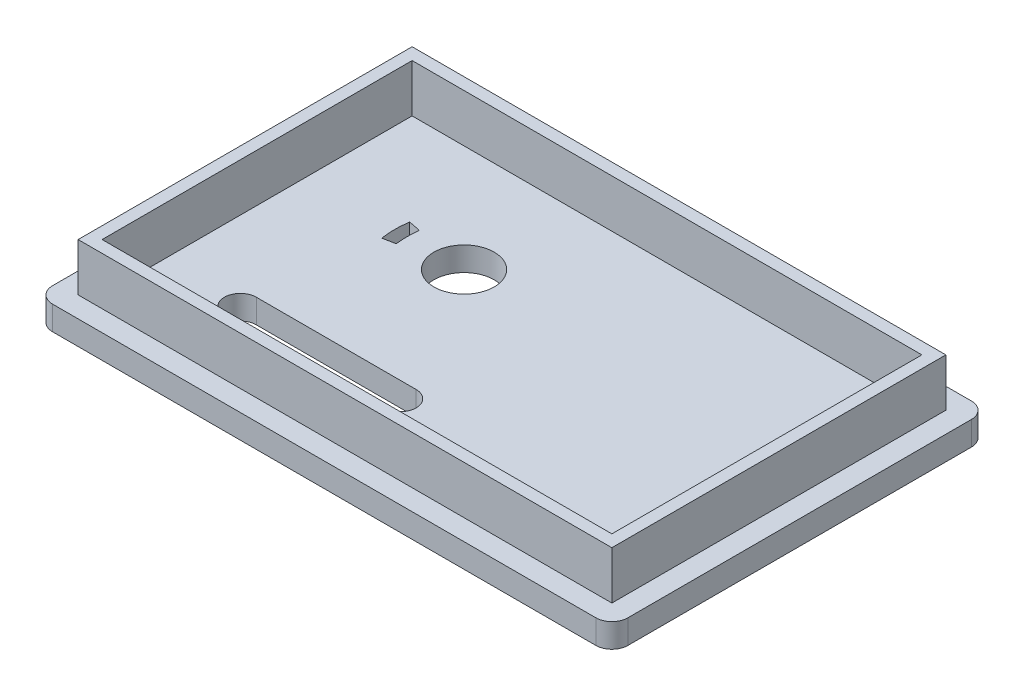
ISO-10303-21;
HEADER;
FILE_DESCRIPTION(('STEP AP214'),'2;1');
FILE_NAME('part.step','',(''),(''),'','','');
FILE_SCHEMA(('AUTOMOTIVE_DESIGN { 1 0 10303 214 1 1 1 1 }'));
ENDSEC;
DATA;
#1=APPLICATION_CONTEXT('core data for automotive mechanical design processes');
#2=APPLICATION_PROTOCOL_DEFINITION('international standard','automotive_design',2000,#1);
#3=PRODUCT_CONTEXT('',#1,'mechanical');
#4=PRODUCT('Part','Part','',(#3));
#5=PRODUCT_RELATED_PRODUCT_CATEGORY('part','',(#4));
#6=PRODUCT_DEFINITION_FORMATION('','',#4);
#7=PRODUCT_DEFINITION_CONTEXT('part definition',#1,'design');
#8=PRODUCT_DEFINITION('design','',#6,#7);
#9=PRODUCT_DEFINITION_SHAPE('','',#8);
#10=(LENGTH_UNIT() NAMED_UNIT(*) SI_UNIT(.MILLI.,.METRE.));
#11=(NAMED_UNIT(*) PLANE_ANGLE_UNIT() SI_UNIT($,.RADIAN.));
#12=(NAMED_UNIT(*) SI_UNIT($,.STERADIAN.) SOLID_ANGLE_UNIT());
#13=UNCERTAINTY_MEASURE_WITH_UNIT(LENGTH_MEASURE(1.E-05),#10,'distance_accuracy_value','');
#14=(GEOMETRIC_REPRESENTATION_CONTEXT(3) GLOBAL_UNCERTAINTY_ASSIGNED_CONTEXT((#13)) GLOBAL_UNIT_ASSIGNED_CONTEXT((#10,
#11,#12)) REPRESENTATION_CONTEXT('',''));
#15=CARTESIAN_POINT('',(0.,0.,0.));
#16=DIRECTION('',(0.,0.,1.));
#17=DIRECTION('',(1.,0.,0.));
#18=AXIS2_PLACEMENT_3D('',#15,#16,#17);
#19=CARTESIAN_POINT('',(0.,3.,0.));
#20=DIRECTION('',(0.,-1.,0.));
#21=DIRECTION('',(0.,0.,-1.));
#22=AXIS2_PLACEMENT_3D('',#19,#20,#21);
#23=PLANE('',#22);
#24=DIRECTION('',(0.,0.,-1.));
#25=VECTOR('',#24,1.);
#26=CARTESIAN_POINT('',(0.,3.,0.));
#27=LINE('',#26,#25);
#28=CARTESIAN_POINT('',(0.,3.,-2.));
#29=VERTEX_POINT('',#28);
#30=CARTESIAN_POINT('',(0.,3.,-45.));
#31=VERTEX_POINT('',#30);
#32=EDGE_CURVE('E370',#29,#31,#27,.T.);
#33=ORIENTED_EDGE('',*,*,#32,.F.);
#34=CARTESIAN_POINT('',(2.,3.,-2.));
#35=DIRECTION('',(0.,-1.,0.));
#36=DIRECTION('',(0.,0.,-1.));
#37=AXIS2_PLACEMENT_3D('',#34,#35,#36);
#38=CIRCLE('',#37,2.);
#39=CARTESIAN_POINT('',(2.,3.,0.));
#40=VERTEX_POINT('',#39);
#41=EDGE_CURVE('E436',#29,#40,#38,.F.);
#42=ORIENTED_EDGE('',*,*,#41,.T.);
#43=DIRECTION('',(1.,0.,0.));
#44=VECTOR('',#43,1.);
#45=CARTESIAN_POINT('',(0.,3.,0.));
#46=LINE('',#45,#44);
#47=CARTESIAN_POINT('',(70.,3.,0.));
#48=VERTEX_POINT('',#47);
#49=EDGE_CURVE('E383',#40,#48,#46,.T.);
#50=ORIENTED_EDGE('',*,*,#49,.T.);
#51=CARTESIAN_POINT('',(70.,3.,-2.));
#52=DIRECTION('',(0.,-1.,0.));
#53=DIRECTION('',(0.,0.,-1.));
#54=AXIS2_PLACEMENT_3D('',#51,#52,#53);
#55=CIRCLE('',#54,2.);
#56=CARTESIAN_POINT('',(72.,3.,-2.));
#57=VERTEX_POINT('',#56);
#58=EDGE_CURVE('E427',#48,#57,#55,.F.);
#59=ORIENTED_EDGE('',*,*,#58,.T.);
#60=DIRECTION('',(0.,0.,-1.));
#61=VECTOR('',#60,1.);
#62=CARTESIAN_POINT('',(72.,3.,0.));
#63=LINE('',#62,#61);
#64=CARTESIAN_POINT('',(72.,3.,-45.));
#65=VERTEX_POINT('',#64);
#66=EDGE_CURVE('E379',#57,#65,#63,.T.);
#67=ORIENTED_EDGE('',*,*,#66,.T.);
#68=CARTESIAN_POINT('',(70.,3.,-45.));
#69=DIRECTION('',(0.,-1.,0.));
#70=DIRECTION('',(0.,0.,-1.));
#71=AXIS2_PLACEMENT_3D('',#68,#69,#70);
#72=CIRCLE('',#71,2.);
#73=CARTESIAN_POINT('',(70.,3.,-47.));
#74=VERTEX_POINT('',#73);
#75=EDGE_CURVE('E430',#65,#74,#72,.F.);
#76=ORIENTED_EDGE('',*,*,#75,.T.);
#77=DIRECTION('',(1.,0.,0.));
#78=VECTOR('',#77,1.);
#79=CARTESIAN_POINT('',(0.,3.,-47.));
#80=LINE('',#79,#78);
#81=CARTESIAN_POINT('',(2.,3.,-47.));
#82=VERTEX_POINT('',#81);
#83=EDGE_CURVE('E374',#82,#74,#80,.T.);
#84=ORIENTED_EDGE('',*,*,#83,.F.);
#85=CARTESIAN_POINT('',(2.,3.,-45.));
#86=DIRECTION('',(0.,-1.,0.));
#87=DIRECTION('',(0.,0.,-1.));
#88=AXIS2_PLACEMENT_3D('',#85,#86,#87);
#89=CIRCLE('',#88,2.);
#90=EDGE_CURVE('E433',#82,#31,#89,.F.);
#91=ORIENTED_EDGE('',*,*,#90,.T.);
#92=EDGE_LOOP('',(#33,#42,#50,#59,#67,#76,#84,#91));
#93=FACE_BOUND('',#92,.T.);
#94=DIRECTION('',(0.,0.,1.));
#95=VECTOR('',#94,1.);
#96=CARTESIAN_POINT('',(2.6,3.,-44.4));
#97=LINE('',#96,#95);
#98=CARTESIAN_POINT('',(2.6,3.,-44.4));
#99=VERTEX_POINT('',#98);
#100=CARTESIAN_POINT('',(2.6,3.,-2.6));
#101=VERTEX_POINT('',#100);
#102=EDGE_CURVE('E324',#99,#101,#97,.T.);
#103=ORIENTED_EDGE('',*,*,#102,.F.);
#104=DIRECTION('',(-1.,0.,0.));
#105=VECTOR('',#104,1.);
#106=CARTESIAN_POINT('',(2.6,3.,-44.4));
#107=LINE('',#106,#105);
#108=CARTESIAN_POINT('',(69.4,3.,-44.4));
#109=VERTEX_POINT('',#108);
#110=EDGE_CURVE('E330',#109,#99,#107,.T.);
#111=ORIENTED_EDGE('',*,*,#110,.F.);
#112=DIRECTION('',(0.,0.,-1.));
#113=VECTOR('',#112,1.);
#114=CARTESIAN_POINT('',(69.4,3.,-44.4));
#115=LINE('',#114,#113);
#116=CARTESIAN_POINT('',(69.4,3.,-2.6));
#117=VERTEX_POINT('',#116);
#118=EDGE_CURVE('E347',#117,#109,#115,.T.);
#119=ORIENTED_EDGE('',*,*,#118,.F.);
#120=DIRECTION('',(1.,0.,0.));
#121=VECTOR('',#120,1.);
#122=CARTESIAN_POINT('',(2.6,3.,-2.6));
#123=LINE('',#122,#121);
#124=EDGE_CURVE('E343',#101,#117,#123,.T.);
#125=ORIENTED_EDGE('',*,*,#124,.F.);
#126=EDGE_LOOP('',(#103,#111,#119,#125));
#127=FACE_BOUND('',#126,.T.);
#128=ADVANCED_FACE('F45',(#93,#127),#23,.F.);
#129=CARTESIAN_POINT('',(0.,3.,0.));
#130=DIRECTION('',(-1.,0.,0.));
#131=DIRECTION('',(0.,0.,1.));
#132=AXIS2_PLACEMENT_3D('',#129,#130,#131);
#133=PLANE('',#132);
#134=DIRECTION('',(0.,0.,-1.));
#135=VECTOR('',#134,1.);
#136=CARTESIAN_POINT('',(0.,0.,0.));
#137=LINE('',#136,#135);
#138=CARTESIAN_POINT('',(0.,0.,-2.));
#139=VERTEX_POINT('',#138);
#140=CARTESIAN_POINT('',(0.,0.,-45.));
#141=VERTEX_POINT('',#140);
#142=EDGE_CURVE('E369',#139,#141,#137,.T.);
#143=ORIENTED_EDGE('',*,*,#142,.F.);
#144=DIRECTION('',(0.,-1.,0.));
#145=VECTOR('',#144,1.);
#146=CARTESIAN_POINT('',(0.,3.,-2.));
#147=LINE('',#146,#145);
#148=EDGE_CURVE('E424',#139,#29,#147,.F.);
#149=ORIENTED_EDGE('',*,*,#148,.T.);
#150=ORIENTED_EDGE('',*,*,#32,.T.);
#151=DIRECTION('',(0.,-1.,0.));
#152=VECTOR('',#151,1.);
#153=CARTESIAN_POINT('',(0.,3.,-45.));
#154=LINE('',#153,#152);
#155=EDGE_CURVE('E420',#31,#141,#154,.T.);
#156=ORIENTED_EDGE('',*,*,#155,.T.);
#157=EDGE_LOOP('',(#143,#149,#150,#156));
#158=FACE_BOUND('',#157,.T.);
#159=ADVANCED_FACE('F505',(#158),#133,.T.);
#160=CARTESIAN_POINT('',(0.,3.,0.));
#161=DIRECTION('',(0.,0.,-1.));
#162=DIRECTION('',(-1.,0.,0.));
#163=AXIS2_PLACEMENT_3D('',#160,#161,#162);
#164=PLANE('',#163);
#165=ORIENTED_EDGE('',*,*,#49,.F.);
#166=DIRECTION('',(0.,-1.,0.));
#167=VECTOR('',#166,1.);
#168=CARTESIAN_POINT('',(2.,0.,0.));
#169=LINE('',#168,#167);
#170=CARTESIAN_POINT('',(2.,0.,0.));
#171=VERTEX_POINT('',#170);
#172=EDGE_CURVE('E404',#40,#171,#169,.T.);
#173=ORIENTED_EDGE('',*,*,#172,.T.);
#174=DIRECTION('',(1.,0.,0.));
#175=VECTOR('',#174,1.);
#176=CARTESIAN_POINT('',(0.,0.,0.));
#177=LINE('',#176,#175);
#178=CARTESIAN_POINT('',(70.,0.,0.));
#179=VERTEX_POINT('',#178);
#180=EDGE_CURVE('E375',#171,#179,#177,.T.);
#181=ORIENTED_EDGE('',*,*,#180,.T.);
#182=DIRECTION('',(0.,-1.,0.));
#183=VECTOR('',#182,1.);
#184=CARTESIAN_POINT('',(70.,3.,0.));
#185=LINE('',#184,#183);
#186=EDGE_CURVE('E387',#179,#48,#185,.F.);
#187=ORIENTED_EDGE('',*,*,#186,.T.);
#188=EDGE_LOOP('',(#165,#173,#181,#187));
#189=FACE_BOUND('',#188,.T.);
#190=ADVANCED_FACE('F513',(#189),#164,.F.);
#191=CARTESIAN_POINT('',(72.,3.,0.));
#192=DIRECTION('',(-1.,0.,0.));
#193=DIRECTION('',(0.,0.,1.));
#194=AXIS2_PLACEMENT_3D('',#191,#192,#193);
#195=PLANE('',#194);
#196=DIRECTION('',(0.,0.,-1.));
#197=VECTOR('',#196,1.);
#198=CARTESIAN_POINT('',(72.,0.,0.));
#199=LINE('',#198,#197);
#200=CARTESIAN_POINT('',(72.,0.,-2.));
#201=VERTEX_POINT('',#200);
#202=CARTESIAN_POINT('',(72.,0.,-45.));
#203=VERTEX_POINT('',#202);
#204=EDGE_CURVE('E395',#201,#203,#199,.T.);
#205=ORIENTED_EDGE('',*,*,#204,.T.);
#206=DIRECTION('',(0.,-1.,0.));
#207=VECTOR('',#206,1.);
#208=CARTESIAN_POINT('',(72.,3.,-45.));
#209=LINE('',#208,#207);
#210=EDGE_CURVE('E450',#203,#65,#209,.F.);
#211=ORIENTED_EDGE('',*,*,#210,.T.);
#212=ORIENTED_EDGE('',*,*,#66,.F.);
#213=DIRECTION('',(0.,-1.,0.));
#214=VECTOR('',#213,1.);
#215=CARTESIAN_POINT('',(72.,3.,-2.));
#216=LINE('',#215,#214);
#217=EDGE_CURVE('E446',#57,#201,#216,.T.);
#218=ORIENTED_EDGE('',*,*,#217,.T.);
#219=EDGE_LOOP('',(#205,#211,#212,#218));
#220=FACE_BOUND('',#219,.T.);
#221=ADVANCED_FACE('F778',(#220),#195,.F.);
#222=CARTESIAN_POINT('',(0.,3.,-47.));
#223=DIRECTION('',(0.,0.,-1.));
#224=DIRECTION('',(-1.,0.,0.));
#225=AXIS2_PLACEMENT_3D('',#222,#223,#224);
#226=PLANE('',#225);
#227=DIRECTION('',(1.,0.,0.));
#228=VECTOR('',#227,1.);
#229=CARTESIAN_POINT('',(0.,0.,-47.));
#230=LINE('',#229,#228);
#231=CARTESIAN_POINT('',(2.,0.,-47.));
#232=VERTEX_POINT('',#231);
#233=CARTESIAN_POINT('',(70.,0.,-47.));
#234=VERTEX_POINT('',#233);
#235=EDGE_CURVE('E391',#232,#234,#230,.T.);
#236=ORIENTED_EDGE('',*,*,#235,.F.);
#237=DIRECTION('',(0.,-1.,0.));
#238=VECTOR('',#237,1.);
#239=CARTESIAN_POINT('',(2.,3.,-47.));
#240=LINE('',#239,#238);
#241=EDGE_CURVE('E443',#232,#82,#240,.F.);
#242=ORIENTED_EDGE('',*,*,#241,.T.);
#243=ORIENTED_EDGE('',*,*,#83,.T.);
#244=DIRECTION('',(0.,-1.,0.));
#245=VECTOR('',#244,1.);
#246=CARTESIAN_POINT('',(70.,0.,-47.));
#247=LINE('',#246,#245);
#248=EDGE_CURVE('E439',#74,#234,#247,.T.);
#249=ORIENTED_EDGE('',*,*,#248,.T.);
#250=EDGE_LOOP('',(#236,#242,#243,#249));
#251=FACE_BOUND('',#250,.T.);
#252=ADVANCED_FACE('F712',(#251),#226,.T.);
#253=CARTESIAN_POINT('',(0.,0.,0.));
#254=DIRECTION('',(0.,-1.,0.));
#255=DIRECTION('',(0.,0.,-1.));
#256=AXIS2_PLACEMENT_3D('',#253,#254,#255);
#257=PLANE('',#256);
#258=CARTESIAN_POINT('',(16.95,0.,-30.95));
#259=CARTESIAN_POINT('',(16.7951710733136,0.,-29.5153310849891));
#260=CARTESIAN_POINT('',(16.95,0.,-28.05));
#261=B_SPLINE_CURVE_WITH_KNOTS('',2,(#258,#259,#260),.UNSPECIFIED.,.F.,.F.,(3,3),(0.,
0.544466012702844),.UNSPECIFIED.);
#262=CARTESIAN_POINT('',(16.95,0.,-30.95));
#263=VERTEX_POINT('',#262);
#264=CARTESIAN_POINT('',(16.95,0.,-28.05));
#265=VERTEX_POINT('',#264);
#266=EDGE_CURVE('E63',#263,#265,#261,.T.);
#267=ORIENTED_EDGE('',*,*,#266,.F.);
#268=DIRECTION('',(0.980580675690921,0.,0.196116135138181));
#269=VECTOR('',#268,1.);
#270=CARTESIAN_POINT('',(16.95,0.,-30.95));
#271=LINE('',#270,#269);
#272=CARTESIAN_POINT('',(15.45,0.,-31.25));
#273=VERTEX_POINT('',#272);
#274=EDGE_CURVE('E230',#273,#263,#271,.T.);
#275=ORIENTED_EDGE('',*,*,#274,.F.);
#276=CARTESIAN_POINT('',(15.45,0.,-27.75));
#277=CARTESIAN_POINT('',(15.1661219200269,0.,-29.5259220278128));
#278=CARTESIAN_POINT('',(15.45,0.,-31.25));
#279=B_SPLINE_CURVE_WITH_KNOTS('',2,(#276,#277,#278),.UNSPECIFIED.,.F.,.F.,(3,3),(0.,
0.895638879453249),.UNSPECIFIED.);
#280=CARTESIAN_POINT('',(15.45,0.,-27.75));
#281=VERTEX_POINT('',#280);
#282=EDGE_CURVE('E212',#281,#273,#279,.T.);
#283=ORIENTED_EDGE('',*,*,#282,.F.);
#284=DIRECTION('',(-0.980580675690921,0.,0.196116135138181));
#285=VECTOR('',#284,1.);
#286=CARTESIAN_POINT('',(16.95,0.,-28.05));
#287=LINE('',#286,#285);
#288=EDGE_CURVE('E222',#265,#281,#287,.T.);
#289=ORIENTED_EDGE('',*,*,#288,.F.);
#290=EDGE_LOOP('',(#267,#275,#283,#289));
#291=FACE_BOUND('',#290,.T.);
#292=CARTESIAN_POINT('',(24.,0.,-29.5));
#293=DIRECTION('',(0.,-1.,0.));
#294=DIRECTION('',(0.,0.,-1.));
#295=AXIS2_PLACEMENT_3D('',#292,#293,#294);
#296=CIRCLE('',#295,3.775);
#297=CARTESIAN_POINT('',(24.,0.,-33.275));
#298=VERTEX_POINT('',#297);
#299=EDGE_CURVE('E245',#298,#298,#296,.T.);
#300=ORIENTED_EDGE('',*,*,#299,.F.);
#301=EDGE_LOOP('',(#300));
#302=FACE_BOUND('',#301,.T.);
#303=CARTESIAN_POINT('',(14.,0.,-11.5));
#304=DIRECTION('',(0.,-1.,0.));
#305=DIRECTION('',(0.,0.,-1.));
#306=AXIS2_PLACEMENT_3D('',#303,#304,#305);
#307=CIRCLE('',#306,2.);
#308=CARTESIAN_POINT('',(14.,0.,-9.5));
#309=VERTEX_POINT('',#308);
#310=CARTESIAN_POINT('',(14.,0.,-13.5));
#311=VERTEX_POINT('',#310);
#312=EDGE_CURVE('E254',#309,#311,#307,.T.);
#313=ORIENTED_EDGE('',*,*,#312,.F.);
#314=DIRECTION('',(-1.,0.,0.));
#315=VECTOR('',#314,1.);
#316=CARTESIAN_POINT('',(14.,0.,-9.5));
#317=LINE('',#316,#315);
#318=CARTESIAN_POINT('',(34.,0.,-9.49999999999999));
#319=VERTEX_POINT('',#318);
#320=EDGE_CURVE('E265',#319,#309,#317,.T.);
#321=ORIENTED_EDGE('',*,*,#320,.F.);
#322=CARTESIAN_POINT('',(34.,0.,-11.5));
#323=DIRECTION('',(0.,-1.,0.));
#324=DIRECTION('',(0.,0.,-1.));
#325=AXIS2_PLACEMENT_3D('',#322,#323,#324);
#326=CIRCLE('',#325,2.);
#327=CARTESIAN_POINT('',(34.,0.,-13.5));
#328=VERTEX_POINT('',#327);
#329=EDGE_CURVE('E261',#328,#319,#326,.T.);
#330=ORIENTED_EDGE('',*,*,#329,.F.);
#331=DIRECTION('',(1.,0.,0.));
#332=VECTOR('',#331,1.);
#333=CARTESIAN_POINT('',(14.,0.,-13.5));
#334=LINE('',#333,#332);
#335=EDGE_CURVE('E257',#311,#328,#334,.T.);
#336=ORIENTED_EDGE('',*,*,#335,.F.);
#337=EDGE_LOOP('',(#313,#321,#330,#336));
#338=FACE_BOUND('',#337,.T.);
#339=ORIENTED_EDGE('',*,*,#180,.F.);
#340=CARTESIAN_POINT('',(2.,0.,-2.));
#341=DIRECTION('',(0.,-1.,0.));
#342=DIRECTION('',(0.,0.,-1.));
#343=AXIS2_PLACEMENT_3D('',#340,#341,#342);
#344=CIRCLE('',#343,2.);
#345=EDGE_CURVE('E417',#171,#139,#344,.T.);
#346=ORIENTED_EDGE('',*,*,#345,.T.);
#347=ORIENTED_EDGE('',*,*,#142,.T.);
#348=CARTESIAN_POINT('',(2.,0.,-45.));
#349=DIRECTION('',(0.,-1.,0.));
#350=DIRECTION('',(0.,0.,-1.));
#351=AXIS2_PLACEMENT_3D('',#348,#349,#350);
#352=CIRCLE('',#351,2.);
#353=EDGE_CURVE('E414',#141,#232,#352,.T.);
#354=ORIENTED_EDGE('',*,*,#353,.T.);
#355=ORIENTED_EDGE('',*,*,#235,.T.);
#356=CARTESIAN_POINT('',(70.,0.,-45.));
#357=DIRECTION('',(0.,-1.,0.));
#358=DIRECTION('',(0.,0.,-1.));
#359=AXIS2_PLACEMENT_3D('',#356,#357,#358);
#360=CIRCLE('',#359,2.);
#361=EDGE_CURVE('E411',#234,#203,#360,.T.);
#362=ORIENTED_EDGE('',*,*,#361,.T.);
#363=ORIENTED_EDGE('',*,*,#204,.F.);
#364=CARTESIAN_POINT('',(70.,0.,-2.));
#365=DIRECTION('',(0.,-1.,0.));
#366=DIRECTION('',(0.,0.,-1.));
#367=AXIS2_PLACEMENT_3D('',#364,#365,#366);
#368=CIRCLE('',#367,2.);
#369=EDGE_CURVE('E408',#201,#179,#368,.T.);
#370=ORIENTED_EDGE('',*,*,#369,.T.);
#371=EDGE_LOOP('',(#339,#346,#347,#354,#355,#362,#363,#370));
#372=FACE_BOUND('',#371,.T.);
#373=ADVANCED_FACE('F227',(#291,#302,#338,#372),#257,.T.);
#374=CARTESIAN_POINT('',(2.,3.,-2.));
#375=DIRECTION('',(0.,1.,0.));
#376=DIRECTION('',(0.,0.,1.));
#377=AXIS2_PLACEMENT_3D('',#374,#375,#376);
#378=CYLINDRICAL_SURFACE('',#377,2.);
#379=ORIENTED_EDGE('',*,*,#41,.F.);
#380=ORIENTED_EDGE('',*,*,#148,.F.);
#381=ORIENTED_EDGE('',*,*,#345,.F.);
#382=ORIENTED_EDGE('',*,*,#172,.F.);
#383=EDGE_LOOP('',(#379,#380,#381,#382));
#384=FACE_BOUND('',#383,.T.);
#385=ADVANCED_FACE('F711',(#384),#378,.T.);
#386=CARTESIAN_POINT('',(2.,3.,-45.));
#387=DIRECTION('',(0.,-1.,0.));
#388=DIRECTION('',(0.,0.,-1.));
#389=AXIS2_PLACEMENT_3D('',#386,#387,#388);
#390=CYLINDRICAL_SURFACE('',#389,2.);
#391=ORIENTED_EDGE('',*,*,#90,.F.);
#392=ORIENTED_EDGE('',*,*,#241,.F.);
#393=ORIENTED_EDGE('',*,*,#353,.F.);
#394=ORIENTED_EDGE('',*,*,#155,.F.);
#395=EDGE_LOOP('',(#391,#392,#393,#394));
#396=FACE_BOUND('',#395,.T.);
#397=ADVANCED_FACE('F727',(#396),#390,.T.);
#398=CARTESIAN_POINT('',(70.,3.,-45.));
#399=DIRECTION('',(0.,1.,0.));
#400=DIRECTION('',(0.,0.,1.));
#401=AXIS2_PLACEMENT_3D('',#398,#399,#400);
#402=CYLINDRICAL_SURFACE('',#401,2.);
#403=ORIENTED_EDGE('',*,*,#75,.F.);
#404=ORIENTED_EDGE('',*,*,#210,.F.);
#405=ORIENTED_EDGE('',*,*,#361,.F.);
#406=ORIENTED_EDGE('',*,*,#248,.F.);
#407=EDGE_LOOP('',(#403,#404,#405,#406));
#408=FACE_BOUND('',#407,.T.);
#409=ADVANCED_FACE('F738',(#408),#402,.T.);
#410=CARTESIAN_POINT('',(70.,3.,-2.));
#411=DIRECTION('',(0.,-1.,0.));
#412=DIRECTION('',(0.,0.,-1.));
#413=AXIS2_PLACEMENT_3D('',#410,#411,#412);
#414=CYLINDRICAL_SURFACE('',#413,2.);
#415=ORIENTED_EDGE('',*,*,#58,.F.);
#416=ORIENTED_EDGE('',*,*,#186,.F.);
#417=ORIENTED_EDGE('',*,*,#369,.F.);
#418=ORIENTED_EDGE('',*,*,#217,.F.);
#419=EDGE_LOOP('',(#415,#416,#417,#418));
#420=FACE_BOUND('',#419,.T.);
#421=ADVANCED_FACE('F47',(#420),#414,.T.);
#422=CARTESIAN_POINT('',(0.,9.,0.));
#423=DIRECTION('',(0.,1.,0.));
#424=DIRECTION('',(0.,0.,1.));
#425=AXIS2_PLACEMENT_3D('',#422,#423,#424);
#426=PLANE('',#425);
#427=DIRECTION('',(0.,0.,1.));
#428=VECTOR('',#427,1.);
#429=CARTESIAN_POINT('',(2.6,9.,-44.4));
#430=LINE('',#429,#428);
#431=CARTESIAN_POINT('',(2.6,9.,-44.4));
#432=VERTEX_POINT('',#431);
#433=CARTESIAN_POINT('',(2.6,9.,-2.6));
#434=VERTEX_POINT('',#433);
#435=EDGE_CURVE('E325',#432,#434,#430,.T.);
#436=ORIENTED_EDGE('',*,*,#435,.T.);
#437=DIRECTION('',(1.,0.,0.));
#438=VECTOR('',#437,1.);
#439=CARTESIAN_POINT('',(2.6,9.,-2.6));
#440=LINE('',#439,#438);
#441=CARTESIAN_POINT('',(69.4,9.,-2.6));
#442=VERTEX_POINT('',#441);
#443=EDGE_CURVE('E329',#434,#442,#440,.T.);
#444=ORIENTED_EDGE('',*,*,#443,.T.);
#445=DIRECTION('',(0.,0.,-1.));
#446=VECTOR('',#445,1.);
#447=CARTESIAN_POINT('',(69.4,9.,-44.4));
#448=LINE('',#447,#446);
#449=CARTESIAN_POINT('',(69.4,9.,-44.4));
#450=VERTEX_POINT('',#449);
#451=EDGE_CURVE('E333',#442,#450,#448,.T.);
#452=ORIENTED_EDGE('',*,*,#451,.T.);
#453=DIRECTION('',(-1.,0.,0.));
#454=VECTOR('',#453,1.);
#455=CARTESIAN_POINT('',(2.6,9.,-44.4));
#456=LINE('',#455,#454);
#457=EDGE_CURVE('E336',#450,#432,#456,.T.);
#458=ORIENTED_EDGE('',*,*,#457,.T.);
#459=EDGE_LOOP('',(#436,#444,#452,#458));
#460=FACE_BOUND('',#459,.T.);
#461=DIRECTION('',(1.,0.,0.));
#462=VECTOR('',#461,1.);
#463=CARTESIAN_POINT('',(4.1,9.,-4.1));
#464=LINE('',#463,#462);
#465=CARTESIAN_POINT('',(4.1,9.,-4.1));
#466=VERTEX_POINT('',#465);
#467=CARTESIAN_POINT('',(67.9,9.,-4.1));
#468=VERTEX_POINT('',#467);
#469=EDGE_CURVE('E286',#466,#468,#464,.T.);
#470=ORIENTED_EDGE('',*,*,#469,.F.);
#471=DIRECTION('',(0.,0.,1.));
#472=VECTOR('',#471,1.);
#473=CARTESIAN_POINT('',(4.1,9.,-42.9));
#474=LINE('',#473,#472);
#475=CARTESIAN_POINT('',(4.1,9.,-42.9));
#476=VERTEX_POINT('',#475);
#477=EDGE_CURVE('E283',#476,#466,#474,.T.);
#478=ORIENTED_EDGE('',*,*,#477,.F.);
#479=DIRECTION('',(-1.,0.,0.));
#480=VECTOR('',#479,1.);
#481=CARTESIAN_POINT('',(4.1,9.,-42.9));
#482=LINE('',#481,#480);
#483=CARTESIAN_POINT('',(67.9,9.,-42.9));
#484=VERTEX_POINT('',#483);
#485=EDGE_CURVE('E294',#484,#476,#482,.T.);
#486=ORIENTED_EDGE('',*,*,#485,.F.);
#487=DIRECTION('',(0.,0.,-1.));
#488=VECTOR('',#487,1.);
#489=CARTESIAN_POINT('',(67.9,9.,-42.9));
#490=LINE('',#489,#488);
#491=EDGE_CURVE('E290',#468,#484,#490,.T.);
#492=ORIENTED_EDGE('',*,*,#491,.F.);
#493=EDGE_LOOP('',(#470,#478,#486,#492));
#494=FACE_BOUND('',#493,.T.);
#495=ADVANCED_FACE('F550',(#460,#494),#426,.T.);
#496=CARTESIAN_POINT('',(2.6,9.,-44.4));
#497=DIRECTION('',(1.,0.,0.));
#498=DIRECTION('',(0.,0.,-1.));
#499=AXIS2_PLACEMENT_3D('',#496,#497,#498);
#500=PLANE('',#499);
#501=ORIENTED_EDGE('',*,*,#102,.T.);
#502=DIRECTION('',(0.,-1.,0.));
#503=VECTOR('',#502,1.);
#504=CARTESIAN_POINT('',(2.6,9.,-2.6));
#505=LINE('',#504,#503);
#506=EDGE_CURVE('E365',#434,#101,#505,.T.);
#507=ORIENTED_EDGE('',*,*,#506,.F.);
#508=ORIENTED_EDGE('',*,*,#435,.F.);
#509=DIRECTION('',(0.,-1.,0.));
#510=VECTOR('',#509,1.);
#511=CARTESIAN_POINT('',(2.6,9.,-44.4));
#512=LINE('',#511,#510);
#513=EDGE_CURVE('E339',#432,#99,#512,.T.);
#514=ORIENTED_EDGE('',*,*,#513,.T.);
#515=EDGE_LOOP('',(#501,#507,#508,#514));
#516=FACE_BOUND('',#515,.T.);
#517=ADVANCED_FACE('F552',(#516),#500,.F.);
#518=CARTESIAN_POINT('',(2.6,9.,-2.6));
#519=DIRECTION('',(0.,0.,-1.));
#520=DIRECTION('',(-1.,0.,0.));
#521=AXIS2_PLACEMENT_3D('',#518,#519,#520);
#522=PLANE('',#521);
#523=ORIENTED_EDGE('',*,*,#124,.T.);
#524=DIRECTION('',(0.,-1.,0.));
#525=VECTOR('',#524,1.);
#526=CARTESIAN_POINT('',(69.4,9.,-2.6));
#527=LINE('',#526,#525);
#528=EDGE_CURVE('E361',#442,#117,#527,.T.);
#529=ORIENTED_EDGE('',*,*,#528,.F.);
#530=ORIENTED_EDGE('',*,*,#443,.F.);
#531=ORIENTED_EDGE('',*,*,#506,.T.);
#532=EDGE_LOOP('',(#523,#529,#530,#531));
#533=FACE_BOUND('',#532,.T.);
#534=ADVANCED_FACE('F560',(#533),#522,.F.);
#535=CARTESIAN_POINT('',(69.4,9.,-44.4));
#536=DIRECTION('',(-1.,0.,0.));
#537=DIRECTION('',(0.,0.,1.));
#538=AXIS2_PLACEMENT_3D('',#535,#536,#537);
#539=PLANE('',#538);
#540=ORIENTED_EDGE('',*,*,#118,.T.);
#541=DIRECTION('',(0.,-1.,0.));
#542=VECTOR('',#541,1.);
#543=CARTESIAN_POINT('',(69.4,9.,-44.4));
#544=LINE('',#543,#542);
#545=EDGE_CURVE('E357',#450,#109,#544,.T.);
#546=ORIENTED_EDGE('',*,*,#545,.F.);
#547=ORIENTED_EDGE('',*,*,#451,.F.);
#548=ORIENTED_EDGE('',*,*,#528,.T.);
#549=EDGE_LOOP('',(#540,#546,#547,#548));
#550=FACE_BOUND('',#549,.T.);
#551=ADVANCED_FACE('F556',(#550),#539,.F.);
#552=CARTESIAN_POINT('',(2.6,9.,-44.4));
#553=DIRECTION('',(0.,0.,1.));
#554=DIRECTION('',(1.,0.,0.));
#555=AXIS2_PLACEMENT_3D('',#552,#553,#554);
#556=PLANE('',#555);
#557=ORIENTED_EDGE('',*,*,#110,.T.);
#558=ORIENTED_EDGE('',*,*,#513,.F.);
#559=ORIENTED_EDGE('',*,*,#457,.F.);
#560=ORIENTED_EDGE('',*,*,#545,.T.);
#561=EDGE_LOOP('',(#557,#558,#559,#560));
#562=FACE_BOUND('',#561,.T.);
#563=ADVANCED_FACE('F548',(#562),#556,.F.);
#564=CARTESIAN_POINT('',(4.1,9.,-42.9));
#565=DIRECTION('',(1.,0.,0.));
#566=DIRECTION('',(0.,0.,-1.));
#567=AXIS2_PLACEMENT_3D('',#564,#565,#566);
#568=PLANE('',#567);
#569=DIRECTION('',(0.,0.,1.));
#570=VECTOR('',#569,1.);
#571=CARTESIAN_POINT('',(4.1,3.,-42.9));
#572=LINE('',#571,#570);
#573=CARTESIAN_POINT('',(4.1,3.,-42.9));
#574=VERTEX_POINT('',#573);
#575=CARTESIAN_POINT('',(4.1,3.,-4.1));
#576=VERTEX_POINT('',#575);
#577=EDGE_CURVE('E273',#574,#576,#572,.T.);
#578=ORIENTED_EDGE('',*,*,#577,.F.);
#579=DIRECTION('',(0.,-1.,0.));
#580=VECTOR('',#579,1.);
#581=CARTESIAN_POINT('',(4.1,9.,-42.9));
#582=LINE('',#581,#580);
#583=EDGE_CURVE('E297',#476,#574,#582,.T.);
#584=ORIENTED_EDGE('',*,*,#583,.F.);
#585=ORIENTED_EDGE('',*,*,#477,.T.);
#586=DIRECTION('',(0.,-1.,0.));
#587=VECTOR('',#586,1.);
#588=CARTESIAN_POINT('',(4.1,9.,-4.1));
#589=LINE('',#588,#587);
#590=EDGE_CURVE('E320',#466,#576,#589,.T.);
#591=ORIENTED_EDGE('',*,*,#590,.T.);
#592=EDGE_LOOP('',(#578,#584,#585,#591));
#593=FACE_BOUND('',#592,.T.);
#594=ADVANCED_FACE('F544',(#593),#568,.T.);
#595=CARTESIAN_POINT('',(4.1,9.,-4.1));
#596=DIRECTION('',(0.,0.,-1.));
#597=DIRECTION('',(-1.,0.,0.));
#598=AXIS2_PLACEMENT_3D('',#595,#596,#597);
#599=PLANE('',#598);
#600=DIRECTION('',(1.,0.,0.));
#601=VECTOR('',#600,1.);
#602=CARTESIAN_POINT('',(4.1,3.,-4.1));
#603=LINE('',#602,#601);
#604=CARTESIAN_POINT('',(67.9,3.,-4.1));
#605=VERTEX_POINT('',#604);
#606=EDGE_CURVE('E301',#576,#605,#603,.T.);
#607=ORIENTED_EDGE('',*,*,#606,.F.);
#608=ORIENTED_EDGE('',*,*,#590,.F.);
#609=ORIENTED_EDGE('',*,*,#469,.T.);
#610=DIRECTION('',(0.,-1.,0.));
#611=VECTOR('',#610,1.);
#612=CARTESIAN_POINT('',(67.9,9.,-4.1));
#613=LINE('',#612,#611);
#614=EDGE_CURVE('E317',#468,#605,#613,.T.);
#615=ORIENTED_EDGE('',*,*,#614,.T.);
#616=EDGE_LOOP('',(#607,#608,#609,#615));
#617=FACE_BOUND('',#616,.T.);
#618=ADVANCED_FACE('F536',(#617),#599,.T.);
#619=CARTESIAN_POINT('',(67.9,9.,-42.9));
#620=DIRECTION('',(-1.,0.,0.));
#621=DIRECTION('',(0.,0.,1.));
#622=AXIS2_PLACEMENT_3D('',#619,#620,#621);
#623=PLANE('',#622);
#624=DIRECTION('',(0.,0.,-1.));
#625=VECTOR('',#624,1.);
#626=CARTESIAN_POINT('',(67.9,3.,-42.9));
#627=LINE('',#626,#625);
#628=CARTESIAN_POINT('',(67.9,3.,-42.9));
#629=VERTEX_POINT('',#628);
#630=EDGE_CURVE('E305',#605,#629,#627,.T.);
#631=ORIENTED_EDGE('',*,*,#630,.F.);
#632=ORIENTED_EDGE('',*,*,#614,.F.);
#633=ORIENTED_EDGE('',*,*,#491,.T.);
#634=DIRECTION('',(0.,-1.,0.));
#635=VECTOR('',#634,1.);
#636=CARTESIAN_POINT('',(67.9,9.,-42.9));
#637=LINE('',#636,#635);
#638=EDGE_CURVE('E314',#484,#629,#637,.T.);
#639=ORIENTED_EDGE('',*,*,#638,.T.);
#640=EDGE_LOOP('',(#631,#632,#633,#639));
#641=FACE_BOUND('',#640,.T.);
#642=ADVANCED_FACE('F530',(#641),#623,.T.);
#643=CARTESIAN_POINT('',(4.1,9.,-42.9));
#644=DIRECTION('',(0.,0.,1.));
#645=DIRECTION('',(1.,0.,0.));
#646=AXIS2_PLACEMENT_3D('',#643,#644,#645);
#647=PLANE('',#646);
#648=DIRECTION('',(-1.,0.,0.));
#649=VECTOR('',#648,1.);
#650=CARTESIAN_POINT('',(4.1,3.,-42.9));
#651=LINE('',#650,#649);
#652=EDGE_CURVE('E287',#629,#574,#651,.T.);
#653=ORIENTED_EDGE('',*,*,#652,.F.);
#654=ORIENTED_EDGE('',*,*,#638,.F.);
#655=ORIENTED_EDGE('',*,*,#485,.T.);
#656=ORIENTED_EDGE('',*,*,#583,.T.);
#657=EDGE_LOOP('',(#653,#654,#655,#656));
#658=FACE_BOUND('',#657,.T.);
#659=ADVANCED_FACE('F521',(#658),#647,.T.);
#660=DIRECTION('',(0.980580675690921,0.,0.196116135138181));
#661=VECTOR('',#660,1.);
#662=CARTESIAN_POINT('',(6.60384615384604,3.,-33.0192307692308));
#663=LINE('',#662,#661);
#664=CARTESIAN_POINT('',(15.45,3.,-31.25));
#665=VERTEX_POINT('',#664);
#666=CARTESIAN_POINT('',(16.95,3.,-30.95));
#667=VERTEX_POINT('',#666);
#668=EDGE_CURVE('E56',#665,#667,#663,.T.);
#669=ORIENTED_EDGE('',*,*,#668,.T.);
#670=CARTESIAN_POINT('',(16.95,3.,-30.95));
#671=CARTESIAN_POINT('',(16.7951710733136,3.,-29.5153310849891));
#672=CARTESIAN_POINT('',(16.95,3.,-28.05));
#673=B_SPLINE_CURVE_WITH_KNOTS('',2,(#670,#671,#672),.UNSPECIFIED.,.F.,.F.,(3,3),(0.,
0.544466012702844),.UNSPECIFIED.);
#674=CARTESIAN_POINT('',(16.95,3.,-28.05));
#675=VERTEX_POINT('',#674);
#676=EDGE_CURVE('E11',#667,#675,#673,.T.);
#677=ORIENTED_EDGE('',*,*,#676,.T.);
#678=DIRECTION('',(-0.980580675690921,0.,0.196116135138181));
#679=VECTOR('',#678,1.);
#680=CARTESIAN_POINT('',(-4.74230769230764,3.,-23.7115384615385));
#681=LINE('',#680,#679);
#682=CARTESIAN_POINT('',(15.45,3.,-27.75));
#683=VERTEX_POINT('',#682);
#684=EDGE_CURVE('E469',#675,#683,#681,.T.);
#685=ORIENTED_EDGE('',*,*,#684,.T.);
#686=CARTESIAN_POINT('',(15.45,3.,-27.75));
#687=CARTESIAN_POINT('',(15.1661219200269,3.,-29.5259220278128));
#688=CARTESIAN_POINT('',(15.45,3.,-31.25));
#689=B_SPLINE_CURVE_WITH_KNOTS('',2,(#686,#687,#688),.UNSPECIFIED.,.F.,.F.,(3,3),(0.,
0.895638879453249),.UNSPECIFIED.);
#690=EDGE_CURVE('E215',#683,#665,#689,.T.);
#691=ORIENTED_EDGE('',*,*,#690,.T.);
#692=EDGE_LOOP('',(#669,#677,#685,#691));
#693=FACE_BOUND('',#692,.T.);
#694=CARTESIAN_POINT('',(24.,3.,-29.5));
#695=DIRECTION('',(0.,-1.,0.));
#696=DIRECTION('',(0.,0.,-1.));
#697=AXIS2_PLACEMENT_3D('',#694,#695,#696);
#698=CIRCLE('',#697,3.775);
#699=CARTESIAN_POINT('',(24.,3.,-33.275));
#700=VERTEX_POINT('',#699);
#701=EDGE_CURVE('E253',#700,#700,#698,.T.);
#702=ORIENTED_EDGE('',*,*,#701,.T.);
#703=EDGE_LOOP('',(#702));
#704=FACE_BOUND('',#703,.T.);
#705=DIRECTION('',(-1.,0.,0.));
#706=VECTOR('',#705,1.);
#707=CARTESIAN_POINT('',(0.,3.,-9.5));
#708=LINE('',#707,#706);
#709=CARTESIAN_POINT('',(34.,3.,-9.49999999999999));
#710=VERTEX_POINT('',#709);
#711=CARTESIAN_POINT('',(14.,3.,-9.5));
#712=VERTEX_POINT('',#711);
#713=EDGE_CURVE('E461',#710,#712,#708,.T.);
#714=ORIENTED_EDGE('',*,*,#713,.T.);
#715=CARTESIAN_POINT('',(14.,3.,-11.5));
#716=DIRECTION('',(0.,-1.,0.));
#717=DIRECTION('',(0.,0.,-1.));
#718=AXIS2_PLACEMENT_3D('',#715,#716,#717);
#719=CIRCLE('',#718,2.);
#720=CARTESIAN_POINT('',(14.,3.,-13.5));
#721=VERTEX_POINT('',#720);
#722=EDGE_CURVE('E465',#712,#721,#719,.T.);
#723=ORIENTED_EDGE('',*,*,#722,.T.);
#724=DIRECTION('',(1.,0.,0.));
#725=VECTOR('',#724,1.);
#726=CARTESIAN_POINT('',(0.,3.,-13.5));
#727=LINE('',#726,#725);
#728=CARTESIAN_POINT('',(34.,3.,-13.5));
#729=VERTEX_POINT('',#728);
#730=EDGE_CURVE('E453',#721,#729,#727,.T.);
#731=ORIENTED_EDGE('',*,*,#730,.T.);
#732=CARTESIAN_POINT('',(34.,3.,-11.5));
#733=DIRECTION('',(0.,-1.,0.));
#734=DIRECTION('',(0.,0.,-1.));
#735=AXIS2_PLACEMENT_3D('',#732,#733,#734);
#736=CIRCLE('',#735,2.);
#737=EDGE_CURVE('E457',#729,#710,#736,.T.);
#738=ORIENTED_EDGE('',*,*,#737,.T.);
#739=EDGE_LOOP('',(#714,#723,#731,#738));
#740=FACE_BOUND('',#739,.T.);
#741=ORIENTED_EDGE('',*,*,#652,.T.);
#742=ORIENTED_EDGE('',*,*,#577,.T.);
#743=ORIENTED_EDGE('',*,*,#606,.T.);
#744=ORIENTED_EDGE('',*,*,#630,.T.);
#745=EDGE_LOOP('',(#741,#742,#743,#744));
#746=FACE_BOUND('',#745,.T.);
#747=ADVANCED_FACE('F484',(#693,#704,#740,#746),#23,.F.);
#748=CARTESIAN_POINT('',(14.,6.,-11.5));
#749=DIRECTION('',(0.,-1.,0.));
#750=DIRECTION('',(0.,0.,-1.));
#751=AXIS2_PLACEMENT_3D('',#748,#749,#750);
#752=CYLINDRICAL_SURFACE('',#751,2.);
#753=DIRECTION('',(0.,-1.,0.));
#754=VECTOR('',#753,1.);
#755=CARTESIAN_POINT('',(14.,6.,-9.5));
#756=LINE('',#755,#754);
#757=EDGE_CURVE('E270',#712,#309,#756,.T.);
#758=ORIENTED_EDGE('',*,*,#757,.T.);
#759=ORIENTED_EDGE('',*,*,#312,.T.);
#760=DIRECTION('',(0.,-1.,0.));
#761=VECTOR('',#760,1.);
#762=CARTESIAN_POINT('',(14.,6.,-13.5));
#763=LINE('',#762,#761);
#764=EDGE_CURVE('E269',#721,#311,#763,.T.);
#765=ORIENTED_EDGE('',*,*,#764,.F.);
#766=ORIENTED_EDGE('',*,*,#722,.F.);
#767=EDGE_LOOP('',(#758,#759,#765,#766));
#768=FACE_BOUND('',#767,.T.);
#769=ADVANCED_FACE('F520',(#768),#752,.F.);
#770=CARTESIAN_POINT('',(14.,6.,-9.5));
#771=DIRECTION('',(0.,0.,1.));
#772=DIRECTION('',(1.,0.,0.));
#773=AXIS2_PLACEMENT_3D('',#770,#771,#772);
#774=PLANE('',#773);
#775=DIRECTION('',(0.,-1.,0.));
#776=VECTOR('',#775,1.);
#777=CARTESIAN_POINT('',(34.,6.,-9.49999999999999));
#778=LINE('',#777,#776);
#779=EDGE_CURVE('E274',#710,#319,#778,.T.);
#780=ORIENTED_EDGE('',*,*,#779,.T.);
#781=ORIENTED_EDGE('',*,*,#320,.T.);
#782=ORIENTED_EDGE('',*,*,#757,.F.);
#783=ORIENTED_EDGE('',*,*,#713,.F.);
#784=EDGE_LOOP('',(#780,#781,#782,#783));
#785=FACE_BOUND('',#784,.T.);
#786=ADVANCED_FACE('F526',(#785),#774,.F.);
#787=CARTESIAN_POINT('',(34.,6.,-11.5));
#788=DIRECTION('',(0.,-1.,0.));
#789=DIRECTION('',(0.,0.,-1.));
#790=AXIS2_PLACEMENT_3D('',#787,#788,#789);
#791=CYLINDRICAL_SURFACE('',#790,2.);
#792=DIRECTION('',(0.,-1.,0.));
#793=VECTOR('',#792,1.);
#794=CARTESIAN_POINT('',(34.,6.,-13.5));
#795=LINE('',#794,#793);
#796=EDGE_CURVE('E277',#729,#328,#795,.T.);
#797=ORIENTED_EDGE('',*,*,#796,.T.);
#798=ORIENTED_EDGE('',*,*,#329,.T.);
#799=ORIENTED_EDGE('',*,*,#779,.F.);
#800=ORIENTED_EDGE('',*,*,#737,.F.);
#801=EDGE_LOOP('',(#797,#798,#799,#800));
#802=FACE_BOUND('',#801,.T.);
#803=ADVANCED_FACE('F638',(#802),#791,.F.);
#804=CARTESIAN_POINT('',(14.,6.,-13.5));
#805=DIRECTION('',(0.,0.,-1.));
#806=DIRECTION('',(-1.,0.,0.));
#807=AXIS2_PLACEMENT_3D('',#804,#805,#806);
#808=PLANE('',#807);
#809=ORIENTED_EDGE('',*,*,#764,.T.);
#810=ORIENTED_EDGE('',*,*,#335,.T.);
#811=ORIENTED_EDGE('',*,*,#796,.F.);
#812=ORIENTED_EDGE('',*,*,#730,.F.);
#813=EDGE_LOOP('',(#809,#810,#811,#812));
#814=FACE_BOUND('',#813,.T.);
#815=ADVANCED_FACE('F499',(#814),#808,.F.);
#816=CARTESIAN_POINT('',(24.,10.,-29.5));
#817=DIRECTION('',(0.,-1.,0.));
#818=DIRECTION('',(0.,0.,-1.));
#819=AXIS2_PLACEMENT_3D('',#816,#817,#818);
#820=CYLINDRICAL_SURFACE('',#819,3.775);
#821=ORIENTED_EDGE('',*,*,#299,.T.);
#822=EDGE_LOOP('',(#821));
#823=FACE_BOUND('',#822,.T.);
#824=ORIENTED_EDGE('',*,*,#701,.F.);
#825=EDGE_LOOP('',(#824));
#826=FACE_BOUND('',#825,.T.);
#827=ADVANCED_FACE('F491',(#823,#826),#820,.F.);
#828=CARTESIAN_POINT('',(16.95,10.,-30.95));
#829=CARTESIAN_POINT('',(16.7951710733136,10.,-29.5153310849891));
#830=CARTESIAN_POINT('',(16.95,10.,-28.05));
#831=B_SPLINE_CURVE_WITH_KNOTS('',2,(#828,#829,#830),.UNSPECIFIED.,.F.,.F.,(3,3),(0.,
0.544466012702844),.UNSPECIFIED.);
#832=DIRECTION('',(0.,-1.,0.));
#833=VECTOR('',#832,1.);
#834=SURFACE_OF_LINEAR_EXTRUSION('',#831,#833);
#835=DIRECTION('',(0.,-1.,0.));
#836=VECTOR('',#835,1.);
#837=CARTESIAN_POINT('',(16.95,10.,-30.95));
#838=LINE('',#837,#836);
#839=EDGE_CURVE('E242',#667,#263,#838,.T.);
#840=ORIENTED_EDGE('',*,*,#839,.T.);
#841=ORIENTED_EDGE('',*,*,#266,.T.);
#842=DIRECTION('',(0.,-1.,0.));
#843=VECTOR('',#842,1.);
#844=CARTESIAN_POINT('',(16.95,10.,-28.05));
#845=LINE('',#844,#843);
#846=EDGE_CURVE('E219',#675,#265,#845,.T.);
#847=ORIENTED_EDGE('',*,*,#846,.F.);
#848=ORIENTED_EDGE('',*,*,#676,.F.);
#849=EDGE_LOOP('',(#840,#841,#847,#848));
#850=FACE_BOUND('',#849,.T.);
#851=ADVANCED_FACE('F489',(#850),#834,.F.);
#852=CARTESIAN_POINT('',(16.95,10.,-30.95));
#853=DIRECTION('',(0.196116135138181,0.,-0.980580675690921));
#854=DIRECTION('',(-0.980580675690921,0.,-0.196116135138181));
#855=AXIS2_PLACEMENT_3D('',#852,#853,#854);
#856=PLANE('',#855);
#857=DIRECTION('',(0.,-1.,0.));
#858=VECTOR('',#857,1.);
#859=CARTESIAN_POINT('',(15.45,10.,-31.25));
#860=LINE('',#859,#858);
#861=EDGE_CURVE('E218',#665,#273,#860,.T.);
#862=ORIENTED_EDGE('',*,*,#861,.T.);
#863=ORIENTED_EDGE('',*,*,#274,.T.);
#864=ORIENTED_EDGE('',*,*,#839,.F.);
#865=ORIENTED_EDGE('',*,*,#668,.F.);
#866=EDGE_LOOP('',(#862,#863,#864,#865));
#867=FACE_BOUND('',#866,.T.);
#868=ADVANCED_FACE('F488',(#867),#856,.F.);
#869=CARTESIAN_POINT('',(15.45,10.,-27.75));
#870=CARTESIAN_POINT('',(15.1661219200269,10.,-29.5259220278128));
#871=CARTESIAN_POINT('',(15.45,10.,-31.25));
#872=B_SPLINE_CURVE_WITH_KNOTS('',2,(#869,#870,#871),.UNSPECIFIED.,.F.,.F.,(3,3),(0.,
0.895638879453249),.UNSPECIFIED.);
#873=DIRECTION('',(0.,-1.,0.));
#874=VECTOR('',#873,1.);
#875=SURFACE_OF_LINEAR_EXTRUSION('',#872,#874);
#876=DIRECTION('',(0.,-1.,0.));
#877=VECTOR('',#876,1.);
#878=CARTESIAN_POINT('',(15.45,10.,-27.75));
#879=LINE('',#878,#877);
#880=EDGE_CURVE('E71',#683,#281,#879,.T.);
#881=ORIENTED_EDGE('',*,*,#880,.T.);
#882=ORIENTED_EDGE('',*,*,#282,.T.);
#883=ORIENTED_EDGE('',*,*,#861,.F.);
#884=ORIENTED_EDGE('',*,*,#690,.F.);
#885=EDGE_LOOP('',(#881,#882,#883,#884));
#886=FACE_BOUND('',#885,.T.);
#887=ADVANCED_FACE('F209',(#886),#875,.F.);
#888=CARTESIAN_POINT('',(16.95,10.,-28.05));
#889=DIRECTION('',(0.196116135138181,0.,0.980580675690921));
#890=DIRECTION('',(0.980580675690921,0.,-0.196116135138181));
#891=AXIS2_PLACEMENT_3D('',#888,#889,#890);
#892=PLANE('',#891);
#893=ORIENTED_EDGE('',*,*,#846,.T.);
#894=ORIENTED_EDGE('',*,*,#288,.T.);
#895=ORIENTED_EDGE('',*,*,#880,.F.);
#896=ORIENTED_EDGE('',*,*,#684,.F.);
#897=EDGE_LOOP('',(#893,#894,#895,#896));
#898=FACE_BOUND('',#897,.T.);
#899=ADVANCED_FACE('F223',(#898),#892,.F.);
#900=CLOSED_SHELL('',(#128,#159,#190,#221,#252,#373,#385,#397,#409,#421,#495,#517,#534,#551,
#563,#594,#618,#642,#659,#747,#769,#786,#803,#815,#827,#851,#868,#887,#899));
#901=MANIFOLD_SOLID_BREP('B2',#900);
#902=ADVANCED_BREP_SHAPE_REPRESENTATION('',(#18,#901),#14);
#903=SHAPE_DEFINITION_REPRESENTATION(#9,#902);
ENDSEC;
END-ISO-10303-21;
